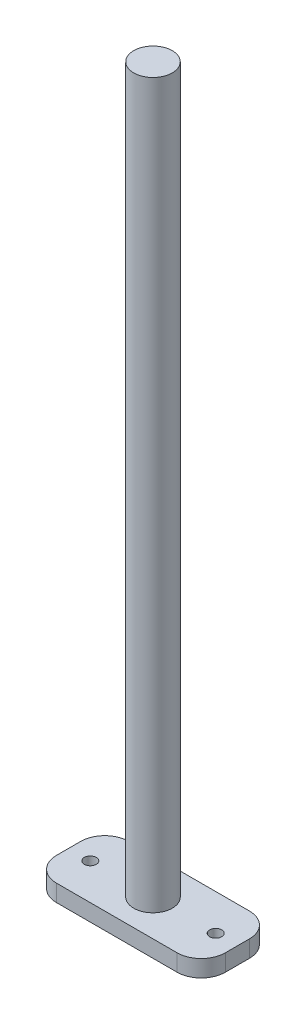
ISO-10303-21;
HEADER;
FILE_DESCRIPTION(('STEP AP214'),'2;1');
FILE_NAME('part.step','',(''),(''),'','','');
FILE_SCHEMA(('AUTOMOTIVE_DESIGN { 1 0 10303 214 1 1 1 1 }'));
ENDSEC;
DATA;
#1=APPLICATION_CONTEXT('core data for automotive mechanical design processes');
#2=APPLICATION_PROTOCOL_DEFINITION('international standard','automotive_design',2000,#1);
#3=PRODUCT_CONTEXT('',#1,'mechanical');
#4=PRODUCT('Part','Part','',(#3));
#5=PRODUCT_RELATED_PRODUCT_CATEGORY('part','',(#4));
#6=PRODUCT_DEFINITION_FORMATION('','',#4);
#7=PRODUCT_DEFINITION_CONTEXT('part definition',#1,'design');
#8=PRODUCT_DEFINITION('design','',#6,#7);
#9=PRODUCT_DEFINITION_SHAPE('','',#8);
#10=(LENGTH_UNIT() NAMED_UNIT(*) SI_UNIT(.MILLI.,.METRE.));
#11=(NAMED_UNIT(*) PLANE_ANGLE_UNIT() SI_UNIT($,.RADIAN.));
#12=(NAMED_UNIT(*) SI_UNIT($,.STERADIAN.) SOLID_ANGLE_UNIT());
#13=UNCERTAINTY_MEASURE_WITH_UNIT(LENGTH_MEASURE(1.E-05),#10,'distance_accuracy_value','');
#14=(GEOMETRIC_REPRESENTATION_CONTEXT(3) GLOBAL_UNCERTAINTY_ASSIGNED_CONTEXT((#13)) GLOBAL_UNIT_ASSIGNED_CONTEXT((#10,
#11,#12)) REPRESENTATION_CONTEXT('',''));
#15=CARTESIAN_POINT('',(0.,0.,0.));
#16=DIRECTION('',(0.,0.,1.));
#17=DIRECTION('',(1.,0.,0.));
#18=AXIS2_PLACEMENT_3D('',#15,#16,#17);
#19=CARTESIAN_POINT('',(17.5,3.5,0.));
#20=DIRECTION('',(1.,0.,0.));
#21=DIRECTION('',(0.,0.,-1.));
#22=AXIS2_PLACEMENT_3D('',#19,#20,#21);
#23=PLANE('',#22);
#24=DIRECTION('',(0.,0.,1.));
#25=VECTOR('',#24,1.);
#26=CARTESIAN_POINT('',(17.5,0.,0.));
#27=LINE('',#26,#25);
#28=CARTESIAN_POINT('',(17.5,0.,-2.49999999999996));
#29=VERTEX_POINT('',#28);
#30=CARTESIAN_POINT('',(17.5,0.,2.49999999999996));
#31=VERTEX_POINT('',#30);
#32=EDGE_CURVE('E157',#29,#31,#27,.T.);
#33=ORIENTED_EDGE('',*,*,#32,.F.);
#34=DIRECTION('',(0.,-1.,0.));
#35=VECTOR('',#34,1.);
#36=CARTESIAN_POINT('',(17.5,3.5,-2.49999999999996));
#37=LINE('',#36,#35);
#38=CARTESIAN_POINT('',(17.5,3.5,-2.49999999999996));
#39=VERTEX_POINT('',#38);
#40=EDGE_CURVE('E11',#39,#29,#37,.T.);
#41=ORIENTED_EDGE('',*,*,#40,.F.);
#42=DIRECTION('',(0.,0.,1.));
#43=VECTOR('',#42,1.);
#44=CARTESIAN_POINT('',(17.5,3.5,0.));
#45=LINE('',#44,#43);
#46=CARTESIAN_POINT('',(17.5,3.5,2.49999999999996));
#47=VERTEX_POINT('',#46);
#48=EDGE_CURVE('E220',#39,#47,#45,.T.);
#49=ORIENTED_EDGE('',*,*,#48,.T.);
#50=DIRECTION('',(0.,-1.,0.));
#51=VECTOR('',#50,1.);
#52=CARTESIAN_POINT('',(17.5,3.5,2.49999999999996));
#53=LINE('',#52,#51);
#54=EDGE_CURVE('E63',#47,#31,#53,.T.);
#55=ORIENTED_EDGE('',*,*,#54,.T.);
#56=EDGE_LOOP('',(#33,#41,#49,#55));
#57=FACE_BOUND('',#56,.T.);
#58=ADVANCED_FACE('F45',(#57),#23,.T.);
#59=CARTESIAN_POINT('',(12.5,3.5,-2.5));
#60=DIRECTION('',(0.,-1.,0.));
#61=DIRECTION('',(0.,0.,-1.));
#62=AXIS2_PLACEMENT_3D('',#59,#60,#61);
#63=CYLINDRICAL_SURFACE('',#62,5.);
#64=CARTESIAN_POINT('',(12.5,0.,-2.5));
#65=DIRECTION('',(0.,1.,0.));
#66=DIRECTION('',(0.,0.,1.));
#67=AXIS2_PLACEMENT_3D('',#64,#65,#66);
#68=CIRCLE('',#67,5.);
#69=CARTESIAN_POINT('',(12.5,0.,-7.5));
#70=VERTEX_POINT('',#69);
#71=EDGE_CURVE('E160',#29,#70,#68,.T.);
#72=ORIENTED_EDGE('',*,*,#71,.T.);
#73=DIRECTION('',(0.,-1.,0.));
#74=VECTOR('',#73,1.);
#75=CARTESIAN_POINT('',(12.5,3.5,-7.5));
#76=LINE('',#75,#74);
#77=CARTESIAN_POINT('',(12.5,3.5,-7.5));
#78=VERTEX_POINT('',#77);
#79=EDGE_CURVE('E55',#78,#70,#76,.T.);
#80=ORIENTED_EDGE('',*,*,#79,.F.);
#81=CARTESIAN_POINT('',(12.5,3.5,-2.5));
#82=DIRECTION('',(0.,1.,0.));
#83=DIRECTION('',(0.,0.,1.));
#84=AXIS2_PLACEMENT_3D('',#81,#82,#83);
#85=CIRCLE('',#84,5.);
#86=EDGE_CURVE('E215',#39,#78,#85,.T.);
#87=ORIENTED_EDGE('',*,*,#86,.F.);
#88=ORIENTED_EDGE('',*,*,#40,.T.);
#89=EDGE_LOOP('',(#72,#80,#87,#88));
#90=FACE_BOUND('',#89,.T.);
#91=ADVANCED_FACE('F207',(#90),#63,.T.);
#92=CARTESIAN_POINT('',(0.,3.5,-7.5));
#93=DIRECTION('',(0.,0.,-1.));
#94=DIRECTION('',(-1.,0.,0.));
#95=AXIS2_PLACEMENT_3D('',#92,#93,#94);
#96=PLANE('',#95);
#97=DIRECTION('',(1.,0.,0.));
#98=VECTOR('',#97,1.);
#99=CARTESIAN_POINT('',(0.,0.,-7.5));
#100=LINE('',#99,#98);
#101=CARTESIAN_POINT('',(-12.5,0.,-7.5));
#102=VERTEX_POINT('',#101);
#103=EDGE_CURVE('E164',#102,#70,#100,.T.);
#104=ORIENTED_EDGE('',*,*,#103,.F.);
#105=DIRECTION('',(0.,-1.,0.));
#106=VECTOR('',#105,1.);
#107=CARTESIAN_POINT('',(-12.5,3.5,-7.5));
#108=LINE('',#107,#106);
#109=CARTESIAN_POINT('',(-12.5,3.5,-7.5));
#110=VERTEX_POINT('',#109);
#111=EDGE_CURVE('E195',#110,#102,#108,.T.);
#112=ORIENTED_EDGE('',*,*,#111,.F.);
#113=DIRECTION('',(1.,0.,0.));
#114=VECTOR('',#113,1.);
#115=CARTESIAN_POINT('',(0.,3.5,-7.5));
#116=LINE('',#115,#114);
#117=EDGE_CURVE('E204',#110,#78,#116,.T.);
#118=ORIENTED_EDGE('',*,*,#117,.T.);
#119=ORIENTED_EDGE('',*,*,#79,.T.);
#120=EDGE_LOOP('',(#104,#112,#118,#119));
#121=FACE_BOUND('',#120,.T.);
#122=ADVANCED_FACE('F202',(#121),#96,.T.);
#123=CARTESIAN_POINT('',(-12.5,3.5,-2.5));
#124=DIRECTION('',(0.,-1.,0.));
#125=DIRECTION('',(0.,0.,-1.));
#126=AXIS2_PLACEMENT_3D('',#123,#124,#125);
#127=CYLINDRICAL_SURFACE('',#126,5.);
#128=CARTESIAN_POINT('',(-12.5,0.,-2.5));
#129=DIRECTION('',(0.,1.,0.));
#130=DIRECTION('',(0.,0.,1.));
#131=AXIS2_PLACEMENT_3D('',#128,#129,#130);
#132=CIRCLE('',#131,5.);
#133=CARTESIAN_POINT('',(-17.5,0.,-2.49999999999996));
#134=VERTEX_POINT('',#133);
#135=EDGE_CURVE('E168',#134,#102,#132,.F.);
#136=ORIENTED_EDGE('',*,*,#135,.F.);
#137=DIRECTION('',(0.,-1.,0.));
#138=VECTOR('',#137,1.);
#139=CARTESIAN_POINT('',(-17.5,3.5,-2.49999999999996));
#140=LINE('',#139,#138);
#141=CARTESIAN_POINT('',(-17.5,3.5,-2.49999999999996));
#142=VERTEX_POINT('',#141);
#143=EDGE_CURVE('E192',#142,#134,#140,.T.);
#144=ORIENTED_EDGE('',*,*,#143,.F.);
#145=CARTESIAN_POINT('',(-12.5,3.5,-2.5));
#146=DIRECTION('',(0.,1.,0.));
#147=DIRECTION('',(0.,0.,1.));
#148=AXIS2_PLACEMENT_3D('',#145,#146,#147);
#149=CIRCLE('',#148,5.);
#150=EDGE_CURVE('E142',#142,#110,#149,.F.);
#151=ORIENTED_EDGE('',*,*,#150,.T.);
#152=ORIENTED_EDGE('',*,*,#111,.T.);
#153=EDGE_LOOP('',(#136,#144,#151,#152));
#154=FACE_BOUND('',#153,.T.);
#155=ADVANCED_FACE('F213',(#154),#127,.T.);
#156=CARTESIAN_POINT('',(-17.5,3.5,0.));
#157=DIRECTION('',(1.,0.,0.));
#158=DIRECTION('',(0.,0.,-1.));
#159=AXIS2_PLACEMENT_3D('',#156,#157,#158);
#160=PLANE('',#159);
#161=DIRECTION('',(0.,0.,1.));
#162=VECTOR('',#161,1.);
#163=CARTESIAN_POINT('',(-17.5,0.,0.));
#164=LINE('',#163,#162);
#165=CARTESIAN_POINT('',(-17.5,0.,2.49999999999996));
#166=VERTEX_POINT('',#165);
#167=EDGE_CURVE('E172',#134,#166,#164,.T.);
#168=ORIENTED_EDGE('',*,*,#167,.T.);
#169=DIRECTION('',(0.,-1.,0.));
#170=VECTOR('',#169,1.);
#171=CARTESIAN_POINT('',(-17.5,3.5,2.49999999999996));
#172=LINE('',#171,#170);
#173=CARTESIAN_POINT('',(-17.5,3.5,2.49999999999996));
#174=VERTEX_POINT('',#173);
#175=EDGE_CURVE('E124',#174,#166,#172,.T.);
#176=ORIENTED_EDGE('',*,*,#175,.F.);
#177=DIRECTION('',(0.,0.,1.));
#178=VECTOR('',#177,1.);
#179=CARTESIAN_POINT('',(-17.5,3.5,0.));
#180=LINE('',#179,#178);
#181=EDGE_CURVE('E137',#142,#174,#180,.T.);
#182=ORIENTED_EDGE('',*,*,#181,.F.);
#183=ORIENTED_EDGE('',*,*,#143,.T.);
#184=EDGE_LOOP('',(#168,#176,#182,#183));
#185=FACE_BOUND('',#184,.T.);
#186=ADVANCED_FACE('F278',(#185),#160,.F.);
#187=CARTESIAN_POINT('',(-12.5,3.5,2.5));
#188=DIRECTION('',(0.,-1.,0.));
#189=DIRECTION('',(0.,0.,-1.));
#190=AXIS2_PLACEMENT_3D('',#187,#188,#189);
#191=CYLINDRICAL_SURFACE('',#190,5.);
#192=CARTESIAN_POINT('',(-12.5,0.,2.5));
#193=DIRECTION('',(0.,1.,0.));
#194=DIRECTION('',(0.,0.,1.));
#195=AXIS2_PLACEMENT_3D('',#192,#193,#194);
#196=CIRCLE('',#195,5.);
#197=CARTESIAN_POINT('',(-12.5,0.,7.5));
#198=VERTEX_POINT('',#197);
#199=EDGE_CURVE('E120',#198,#166,#196,.F.);
#200=ORIENTED_EDGE('',*,*,#199,.F.);
#201=DIRECTION('',(0.,-1.,0.));
#202=VECTOR('',#201,1.);
#203=CARTESIAN_POINT('',(-12.5,3.5,7.5));
#204=LINE('',#203,#202);
#205=CARTESIAN_POINT('',(-12.5,3.5,7.5));
#206=VERTEX_POINT('',#205);
#207=EDGE_CURVE('E114',#206,#198,#204,.T.);
#208=ORIENTED_EDGE('',*,*,#207,.F.);
#209=CARTESIAN_POINT('',(-12.5,3.5,2.5));
#210=DIRECTION('',(0.,1.,0.));
#211=DIRECTION('',(0.,0.,1.));
#212=AXIS2_PLACEMENT_3D('',#209,#210,#211);
#213=CIRCLE('',#212,5.);
#214=EDGE_CURVE('E118',#206,#174,#213,.F.);
#215=ORIENTED_EDGE('',*,*,#214,.T.);
#216=ORIENTED_EDGE('',*,*,#175,.T.);
#217=EDGE_LOOP('',(#200,#208,#215,#216));
#218=FACE_BOUND('',#217,.T.);
#219=ADVANCED_FACE('F116',(#218),#191,.T.);
#220=CARTESIAN_POINT('',(0.,3.5,7.5));
#221=DIRECTION('',(0.,0.,-1.));
#222=DIRECTION('',(-1.,0.,0.));
#223=AXIS2_PLACEMENT_3D('',#220,#221,#222);
#224=PLANE('',#223);
#225=DIRECTION('',(1.,0.,0.));
#226=VECTOR('',#225,1.);
#227=CARTESIAN_POINT('',(0.,0.,7.5));
#228=LINE('',#227,#226);
#229=CARTESIAN_POINT('',(12.5,0.,7.5));
#230=VERTEX_POINT('',#229);
#231=EDGE_CURVE('E178',#198,#230,#228,.T.);
#232=ORIENTED_EDGE('',*,*,#231,.T.);
#233=DIRECTION('',(0.,-1.,0.));
#234=VECTOR('',#233,1.);
#235=CARTESIAN_POINT('',(12.5,3.5,7.5));
#236=LINE('',#235,#234);
#237=CARTESIAN_POINT('',(12.5,3.5,7.5));
#238=VERTEX_POINT('',#237);
#239=EDGE_CURVE('E89',#238,#230,#236,.T.);
#240=ORIENTED_EDGE('',*,*,#239,.F.);
#241=DIRECTION('',(1.,0.,0.));
#242=VECTOR('',#241,1.);
#243=CARTESIAN_POINT('',(0.,3.5,7.5));
#244=LINE('',#243,#242);
#245=EDGE_CURVE('E126',#206,#238,#244,.T.);
#246=ORIENTED_EDGE('',*,*,#245,.F.);
#247=ORIENTED_EDGE('',*,*,#207,.T.);
#248=EDGE_LOOP('',(#232,#240,#246,#247));
#249=FACE_BOUND('',#248,.T.);
#250=ADVANCED_FACE('F127',(#249),#224,.F.);
#251=CARTESIAN_POINT('',(13.,3.5,0.));
#252=DIRECTION('',(0.,-1.,0.));
#253=DIRECTION('',(0.,0.,-1.));
#254=AXIS2_PLACEMENT_3D('',#251,#252,#253);
#255=CYLINDRICAL_SURFACE('',#254,1.25);
#256=CARTESIAN_POINT('',(13.,3.5,0.));
#257=DIRECTION('',(0.,1.,0.));
#258=DIRECTION('',(0.,0.,1.));
#259=AXIS2_PLACEMENT_3D('',#256,#257,#258);
#260=CIRCLE('',#259,1.25);
#261=CARTESIAN_POINT('',(13.,3.5,1.25));
#262=VERTEX_POINT('',#261);
#263=EDGE_CURVE('E225',#262,#262,#260,.T.);
#264=ORIENTED_EDGE('',*,*,#263,.T.);
#265=EDGE_LOOP('',(#264));
#266=FACE_BOUND('',#265,.T.);
#267=CARTESIAN_POINT('',(13.,0.,0.));
#268=DIRECTION('',(0.,1.,0.));
#269=DIRECTION('',(0.,0.,1.));
#270=AXIS2_PLACEMENT_3D('',#267,#268,#269);
#271=CIRCLE('',#270,1.25);
#272=CARTESIAN_POINT('',(13.,0.,1.25));
#273=VERTEX_POINT('',#272);
#274=EDGE_CURVE('E152',#273,#273,#271,.T.);
#275=ORIENTED_EDGE('',*,*,#274,.F.);
#276=EDGE_LOOP('',(#275));
#277=FACE_BOUND('',#276,.T.);
#278=ADVANCED_FACE('F256',(#266,#277),#255,.F.);
#279=CARTESIAN_POINT('',(-13.,3.5,0.));
#280=DIRECTION('',(0.,-1.,0.));
#281=DIRECTION('',(0.,0.,-1.));
#282=AXIS2_PLACEMENT_3D('',#279,#280,#281);
#283=CYLINDRICAL_SURFACE('',#282,1.25);
#284=CARTESIAN_POINT('',(-13.,3.5,0.));
#285=DIRECTION('',(0.,1.,0.));
#286=DIRECTION('',(0.,0.,1.));
#287=AXIS2_PLACEMENT_3D('',#284,#285,#286);
#288=CIRCLE('',#287,1.25);
#289=CARTESIAN_POINT('',(-13.,3.5,1.25));
#290=VERTEX_POINT('',#289);
#291=EDGE_CURVE('E185',#290,#290,#288,.T.);
#292=ORIENTED_EDGE('',*,*,#291,.T.);
#293=EDGE_LOOP('',(#292));
#294=FACE_BOUND('',#293,.T.);
#295=CARTESIAN_POINT('',(-13.,0.,0.));
#296=DIRECTION('',(0.,1.,0.));
#297=DIRECTION('',(0.,0.,1.));
#298=AXIS2_PLACEMENT_3D('',#295,#296,#297);
#299=CIRCLE('',#298,1.25);
#300=CARTESIAN_POINT('',(-13.,0.,1.25));
#301=VERTEX_POINT('',#300);
#302=EDGE_CURVE('E148',#301,#301,#299,.T.);
#303=ORIENTED_EDGE('',*,*,#302,.F.);
#304=EDGE_LOOP('',(#303));
#305=FACE_BOUND('',#304,.T.);
#306=ADVANCED_FACE('F47',(#294,#305),#283,.F.);
#307=CARTESIAN_POINT('',(12.5,3.5,2.5));
#308=DIRECTION('',(0.,-1.,0.));
#309=DIRECTION('',(0.,0.,-1.));
#310=AXIS2_PLACEMENT_3D('',#307,#308,#309);
#311=CYLINDRICAL_SURFACE('',#310,5.);
#312=CARTESIAN_POINT('',(12.5,0.,2.5));
#313=DIRECTION('',(0.,1.,0.));
#314=DIRECTION('',(0.,0.,1.));
#315=AXIS2_PLACEMENT_3D('',#312,#313,#314);
#316=CIRCLE('',#315,5.);
#317=EDGE_CURVE('E181',#31,#230,#316,.F.);
#318=ORIENTED_EDGE('',*,*,#317,.F.);
#319=ORIENTED_EDGE('',*,*,#54,.F.);
#320=CARTESIAN_POINT('',(12.5,3.5,2.5));
#321=DIRECTION('',(0.,1.,0.));
#322=DIRECTION('',(0.,0.,1.));
#323=AXIS2_PLACEMENT_3D('',#320,#321,#322);
#324=CIRCLE('',#323,5.);
#325=EDGE_CURVE('E131',#47,#238,#324,.F.);
#326=ORIENTED_EDGE('',*,*,#325,.T.);
#327=ORIENTED_EDGE('',*,*,#239,.T.);
#328=EDGE_LOOP('',(#318,#319,#326,#327));
#329=FACE_BOUND('',#328,.T.);
#330=ADVANCED_FACE('F250',(#329),#311,.T.);
#331=CARTESIAN_POINT('',(0.,3.5,0.));
#332=DIRECTION('',(0.,1.,0.));
#333=DIRECTION('',(0.,0.,1.));
#334=AXIS2_PLACEMENT_3D('',#331,#332,#333);
#335=PLANE('',#334);
#336=CARTESIAN_POINT('',(0.,3.5,0.));
#337=DIRECTION('',(0.,1.,0.));
#338=DIRECTION('',(0.,0.,1.));
#339=AXIS2_PLACEMENT_3D('',#336,#337,#338);
#340=CIRCLE('',#339,4.);
#341=CARTESIAN_POINT('',(0.,3.5,4.));
#342=VERTEX_POINT('',#341);
#343=EDGE_CURVE('E232',#342,#342,#340,.T.);
#344=ORIENTED_EDGE('',*,*,#343,.F.);
#345=EDGE_LOOP('',(#344));
#346=FACE_BOUND('',#345,.T.);
#347=ORIENTED_EDGE('',*,*,#291,.F.);
#348=EDGE_LOOP('',(#347));
#349=FACE_BOUND('',#348,.T.);
#350=ORIENTED_EDGE('',*,*,#263,.F.);
#351=EDGE_LOOP('',(#350));
#352=FACE_BOUND('',#351,.T.);
#353=ORIENTED_EDGE('',*,*,#48,.F.);
#354=ORIENTED_EDGE('',*,*,#86,.T.);
#355=ORIENTED_EDGE('',*,*,#117,.F.);
#356=ORIENTED_EDGE('',*,*,#150,.F.);
#357=ORIENTED_EDGE('',*,*,#181,.T.);
#358=ORIENTED_EDGE('',*,*,#214,.F.);
#359=ORIENTED_EDGE('',*,*,#245,.T.);
#360=ORIENTED_EDGE('',*,*,#325,.F.);
#361=EDGE_LOOP('',(#353,#354,#355,#356,#357,#358,#359,#360));
#362=FACE_BOUND('',#361,.T.);
#363=ADVANCED_FACE('F134',(#346,#349,#352,#362),#335,.T.);
#364=CARTESIAN_POINT('',(0.,0.,0.));
#365=DIRECTION('',(0.,1.,0.));
#366=DIRECTION('',(0.,0.,1.));
#367=AXIS2_PLACEMENT_3D('',#364,#365,#366);
#368=PLANE('',#367);
#369=ORIENTED_EDGE('',*,*,#302,.T.);
#370=EDGE_LOOP('',(#369));
#371=FACE_BOUND('',#370,.T.);
#372=ORIENTED_EDGE('',*,*,#274,.T.);
#373=EDGE_LOOP('',(#372));
#374=FACE_BOUND('',#373,.T.);
#375=ORIENTED_EDGE('',*,*,#32,.T.);
#376=ORIENTED_EDGE('',*,*,#317,.T.);
#377=ORIENTED_EDGE('',*,*,#231,.F.);
#378=ORIENTED_EDGE('',*,*,#199,.T.);
#379=ORIENTED_EDGE('',*,*,#167,.F.);
#380=ORIENTED_EDGE('',*,*,#135,.T.);
#381=ORIENTED_EDGE('',*,*,#103,.T.);
#382=ORIENTED_EDGE('',*,*,#71,.F.);
#383=EDGE_LOOP('',(#375,#376,#377,#378,#379,#380,#381,#382));
#384=FACE_BOUND('',#383,.T.);
#385=ADVANCED_FACE('F209',(#371,#374,#384),#368,.F.);
#386=CARTESIAN_POINT('',(0.,153.5,0.));
#387=DIRECTION('',(0.,-1.,0.));
#388=DIRECTION('',(0.,0.,-1.));
#389=AXIS2_PLACEMENT_3D('',#386,#387,#388);
#390=CYLINDRICAL_SURFACE('',#389,4.);
#391=CARTESIAN_POINT('',(0.,153.5,0.));
#392=DIRECTION('',(0.,1.,0.));
#393=DIRECTION('',(0.,0.,1.));
#394=AXIS2_PLACEMENT_3D('',#391,#392,#393);
#395=CIRCLE('',#394,4.);
#396=CARTESIAN_POINT('',(0.,153.5,4.));
#397=VERTEX_POINT('',#396);
#398=EDGE_CURVE('E153',#397,#397,#395,.T.);
#399=ORIENTED_EDGE('',*,*,#398,.F.);
#400=EDGE_LOOP('',(#399));
#401=FACE_BOUND('',#400,.T.);
#402=ORIENTED_EDGE('',*,*,#343,.T.);
#403=EDGE_LOOP('',(#402));
#404=FACE_BOUND('',#403,.T.);
#405=ADVANCED_FACE('F242',(#401,#404),#390,.T.);
#406=CARTESIAN_POINT('',(0.,153.5,0.));
#407=DIRECTION('',(0.,1.,0.));
#408=DIRECTION('',(0.,0.,1.));
#409=AXIS2_PLACEMENT_3D('',#406,#407,#408);
#410=PLANE('',#409);
#411=ORIENTED_EDGE('',*,*,#398,.T.);
#412=EDGE_LOOP('',(#411));
#413=FACE_BOUND('',#412,.T.);
#414=ADVANCED_FACE('F240',(#413),#410,.T.);
#415=CLOSED_SHELL('',(#58,#91,#122,#155,#186,#219,#250,#278,#306,#330,#363,#385,#405,#414));
#416=MANIFOLD_SOLID_BREP('B2',#415);
#417=ADVANCED_BREP_SHAPE_REPRESENTATION('',(#18,#416),#14);
#418=SHAPE_DEFINITION_REPRESENTATION(#9,#417);
ENDSEC;
END-ISO-10303-21;
